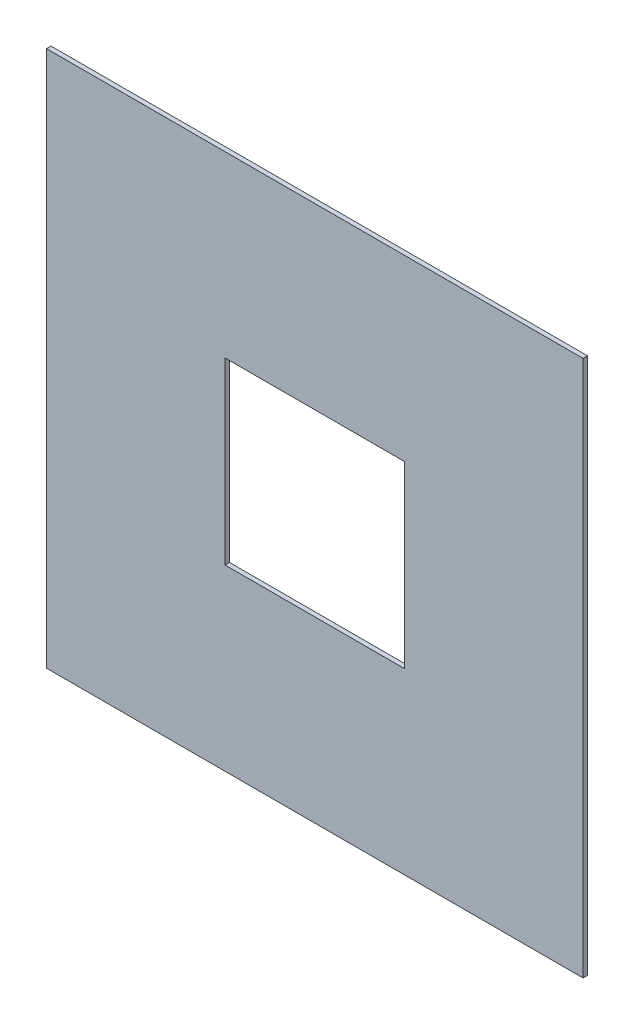
ISO-10303-21;
HEADER;
FILE_DESCRIPTION(('STEP AP214'),'2;1');
FILE_NAME('part.step','',(''),(''),'','','');
FILE_SCHEMA(('AUTOMOTIVE_DESIGN { 1 0 10303 214 1 1 1 1 }'));
ENDSEC;
DATA;
#1=APPLICATION_CONTEXT('core data for automotive mechanical design processes');
#2=APPLICATION_PROTOCOL_DEFINITION('international standard','automotive_design',2000,#1);
#3=PRODUCT_CONTEXT('',#1,'mechanical');
#4=PRODUCT('Part','Part','',(#3));
#5=PRODUCT_RELATED_PRODUCT_CATEGORY('part','',(#4));
#6=PRODUCT_DEFINITION_FORMATION('','',#4);
#7=PRODUCT_DEFINITION_CONTEXT('part definition',#1,'design');
#8=PRODUCT_DEFINITION('design','',#6,#7);
#9=PRODUCT_DEFINITION_SHAPE('','',#8);
#10=(LENGTH_UNIT() NAMED_UNIT(*) SI_UNIT(.MILLI.,.METRE.));
#11=(NAMED_UNIT(*) PLANE_ANGLE_UNIT() SI_UNIT($,.RADIAN.));
#12=(NAMED_UNIT(*) SI_UNIT($,.STERADIAN.) SOLID_ANGLE_UNIT());
#13=UNCERTAINTY_MEASURE_WITH_UNIT(LENGTH_MEASURE(1.E-05),#10,'distance_accuracy_value','');
#14=(GEOMETRIC_REPRESENTATION_CONTEXT(3) GLOBAL_UNCERTAINTY_ASSIGNED_CONTEXT((#13)) GLOBAL_UNIT_ASSIGNED_CONTEXT((#10,
#11,#12)) REPRESENTATION_CONTEXT('',''));
#15=CARTESIAN_POINT('',(0.,0.,0.));
#16=DIRECTION('',(0.,0.,1.));
#17=DIRECTION('',(1.,0.,0.));
#18=AXIS2_PLACEMENT_3D('',#15,#16,#17);
#19=CARTESIAN_POINT('',(0.,0.,1.));
#20=DIRECTION('',(0.,0.,1.));
#21=DIRECTION('',(1.,0.,0.));
#22=AXIS2_PLACEMENT_3D('',#19,#20,#21);
#23=PLANE('',#22);
#24=DIRECTION('',(0.,1.,0.));
#25=VECTOR('',#24,1.);
#26=CARTESIAN_POINT('',(60.,60.,1.));
#27=LINE('',#26,#25);
#28=CARTESIAN_POINT('',(60.,-60.,1.));
#29=VERTEX_POINT('',#28);
#30=CARTESIAN_POINT('',(60.,60.,1.));
#31=VERTEX_POINT('',#30);
#32=EDGE_CURVE('E153',#29,#31,#27,.T.);
#33=ORIENTED_EDGE('',*,*,#32,.T.);
#34=DIRECTION('',(-1.,0.,0.));
#35=VECTOR('',#34,1.);
#36=CARTESIAN_POINT('',(-60.,60.,1.));
#37=LINE('',#36,#35);
#38=CARTESIAN_POINT('',(-60.,60.,1.));
#39=VERTEX_POINT('',#38);
#40=EDGE_CURVE('E157',#31,#39,#37,.T.);
#41=ORIENTED_EDGE('',*,*,#40,.T.);
#42=DIRECTION('',(0.,-1.,0.));
#43=VECTOR('',#42,1.);
#44=CARTESIAN_POINT('',(-60.,60.,1.));
#45=LINE('',#44,#43);
#46=CARTESIAN_POINT('',(-60.,-60.,1.));
#47=VERTEX_POINT('',#46);
#48=EDGE_CURVE('E161',#39,#47,#45,.T.);
#49=ORIENTED_EDGE('',*,*,#48,.T.);
#50=DIRECTION('',(1.,0.,0.));
#51=VECTOR('',#50,1.);
#52=CARTESIAN_POINT('',(-60.,-60.,1.));
#53=LINE('',#52,#51);
#54=EDGE_CURVE('E164',#47,#29,#53,.T.);
#55=ORIENTED_EDGE('',*,*,#54,.T.);
#56=EDGE_LOOP('',(#33,#41,#49,#55));
#57=FACE_BOUND('',#56,.T.);
#58=DIRECTION('',(-1.,0.,0.));
#59=VECTOR('',#58,1.);
#60=CARTESIAN_POINT('',(-20.05,20.05,1.));
#61=LINE('',#60,#59);
#62=CARTESIAN_POINT('',(20.05,20.05,1.));
#63=VERTEX_POINT('',#62);
#64=CARTESIAN_POINT('',(-20.05,20.05,1.));
#65=VERTEX_POINT('',#64);
#66=EDGE_CURVE('E114',#63,#65,#61,.T.);
#67=ORIENTED_EDGE('',*,*,#66,.F.);
#68=DIRECTION('',(0.,1.,0.));
#69=VECTOR('',#68,1.);
#70=CARTESIAN_POINT('',(20.05,20.05,1.));
#71=LINE('',#70,#69);
#72=CARTESIAN_POINT('',(20.05,-20.05,1.));
#73=VERTEX_POINT('',#72);
#74=EDGE_CURVE('E105',#73,#63,#71,.T.);
#75=ORIENTED_EDGE('',*,*,#74,.F.);
#76=DIRECTION('',(1.,0.,0.));
#77=VECTOR('',#76,1.);
#78=CARTESIAN_POINT('',(-20.05,-20.05,1.));
#79=LINE('',#78,#77);
#80=CARTESIAN_POINT('',(-20.05,-20.05,1.));
#81=VERTEX_POINT('',#80);
#82=EDGE_CURVE('E131',#81,#73,#79,.T.);
#83=ORIENTED_EDGE('',*,*,#82,.F.);
#84=DIRECTION('',(0.,-1.,0.));
#85=VECTOR('',#84,1.);
#86=CARTESIAN_POINT('',(-20.05,20.05,1.));
#87=LINE('',#86,#85);
#88=EDGE_CURVE('E127',#65,#81,#87,.T.);
#89=ORIENTED_EDGE('',*,*,#88,.F.);
#90=EDGE_LOOP('',(#67,#75,#83,#89));
#91=FACE_BOUND('',#90,.T.);
#92=ADVANCED_FACE('F39',(#57,#91),#23,.T.);
#93=CARTESIAN_POINT('',(0.,0.,0.));
#94=DIRECTION('',(0.,0.,1.));
#95=DIRECTION('',(1.,0.,0.));
#96=AXIS2_PLACEMENT_3D('',#93,#94,#95);
#97=PLANE('',#96);
#98=DIRECTION('',(0.,1.,0.));
#99=VECTOR('',#98,1.);
#100=CARTESIAN_POINT('',(60.,60.,0.));
#101=LINE('',#100,#99);
#102=CARTESIAN_POINT('',(60.,-60.,0.));
#103=VERTEX_POINT('',#102);
#104=CARTESIAN_POINT('',(60.,60.,0.));
#105=VERTEX_POINT('',#104);
#106=EDGE_CURVE('E123',#103,#105,#101,.T.);
#107=ORIENTED_EDGE('',*,*,#106,.F.);
#108=DIRECTION('',(1.,0.,0.));
#109=VECTOR('',#108,1.);
#110=CARTESIAN_POINT('',(-60.,-60.,0.));
#111=LINE('',#110,#109);
#112=CARTESIAN_POINT('',(-60.,-60.,0.));
#113=VERTEX_POINT('',#112);
#114=EDGE_CURVE('E158',#113,#103,#111,.T.);
#115=ORIENTED_EDGE('',*,*,#114,.F.);
#116=DIRECTION('',(0.,-1.,0.));
#117=VECTOR('',#116,1.);
#118=CARTESIAN_POINT('',(-60.,60.,0.));
#119=LINE('',#118,#117);
#120=CARTESIAN_POINT('',(-60.,60.,0.));
#121=VERTEX_POINT('',#120);
#122=EDGE_CURVE('E174',#121,#113,#119,.T.);
#123=ORIENTED_EDGE('',*,*,#122,.F.);
#124=DIRECTION('',(-1.,0.,0.));
#125=VECTOR('',#124,1.);
#126=CARTESIAN_POINT('',(-60.,60.,0.));
#127=LINE('',#126,#125);
#128=EDGE_CURVE('E171',#105,#121,#127,.T.);
#129=ORIENTED_EDGE('',*,*,#128,.F.);
#130=EDGE_LOOP('',(#107,#115,#123,#129));
#131=FACE_BOUND('',#130,.T.);
#132=DIRECTION('',(0.,1.,0.));
#133=VECTOR('',#132,1.);
#134=CARTESIAN_POINT('',(20.05,20.05,0.));
#135=LINE('',#134,#133);
#136=CARTESIAN_POINT('',(20.05,-20.05,0.));
#137=VERTEX_POINT('',#136);
#138=CARTESIAN_POINT('',(20.05,20.05,0.));
#139=VERTEX_POINT('',#138);
#140=EDGE_CURVE('E63',#137,#139,#135,.T.);
#141=ORIENTED_EDGE('',*,*,#140,.T.);
#142=DIRECTION('',(-1.,0.,0.));
#143=VECTOR('',#142,1.);
#144=CARTESIAN_POINT('',(-20.05,20.05,0.));
#145=LINE('',#144,#143);
#146=CARTESIAN_POINT('',(-20.05,20.05,0.));
#147=VERTEX_POINT('',#146);
#148=EDGE_CURVE('E121',#139,#147,#145,.T.);
#149=ORIENTED_EDGE('',*,*,#148,.T.);
#150=DIRECTION('',(0.,-1.,0.));
#151=VECTOR('',#150,1.);
#152=CARTESIAN_POINT('',(-20.05,20.05,0.));
#153=LINE('',#152,#151);
#154=CARTESIAN_POINT('',(-20.05,-20.05,0.));
#155=VERTEX_POINT('',#154);
#156=EDGE_CURVE('E140',#147,#155,#153,.T.);
#157=ORIENTED_EDGE('',*,*,#156,.T.);
#158=DIRECTION('',(1.,0.,0.));
#159=VECTOR('',#158,1.);
#160=CARTESIAN_POINT('',(-20.05,-20.05,0.));
#161=LINE('',#160,#159);
#162=EDGE_CURVE('E115',#155,#137,#161,.T.);
#163=ORIENTED_EDGE('',*,*,#162,.T.);
#164=EDGE_LOOP('',(#141,#149,#157,#163));
#165=FACE_BOUND('',#164,.T.);
#166=ADVANCED_FACE('F197',(#131,#165),#97,.F.);
#167=CARTESIAN_POINT('',(60.,60.,1.));
#168=DIRECTION('',(-1.,0.,0.));
#169=DIRECTION('',(0.,-1.,0.));
#170=AXIS2_PLACEMENT_3D('',#167,#168,#169);
#171=PLANE('',#170);
#172=ORIENTED_EDGE('',*,*,#106,.T.);
#173=DIRECTION('',(0.,0.,-1.));
#174=VECTOR('',#173,1.);
#175=CARTESIAN_POINT('',(60.,60.,1.));
#176=LINE('',#175,#174);
#177=EDGE_CURVE('E11',#31,#105,#176,.T.);
#178=ORIENTED_EDGE('',*,*,#177,.F.);
#179=ORIENTED_EDGE('',*,*,#32,.F.);
#180=DIRECTION('',(0.,0.,-1.));
#181=VECTOR('',#180,1.);
#182=CARTESIAN_POINT('',(60.,-60.,1.));
#183=LINE('',#182,#181);
#184=EDGE_CURVE('E167',#29,#103,#183,.T.);
#185=ORIENTED_EDGE('',*,*,#184,.T.);
#186=EDGE_LOOP('',(#172,#178,#179,#185));
#187=FACE_BOUND('',#186,.T.);
#188=ADVANCED_FACE('F41',(#187),#171,.F.);
#189=CARTESIAN_POINT('',(-60.,60.,1.));
#190=DIRECTION('',(0.,-1.,0.));
#191=DIRECTION('',(0.,0.,-1.));
#192=AXIS2_PLACEMENT_3D('',#189,#190,#191);
#193=PLANE('',#192);
#194=ORIENTED_EDGE('',*,*,#128,.T.);
#195=DIRECTION('',(0.,0.,-1.));
#196=VECTOR('',#195,1.);
#197=CARTESIAN_POINT('',(-60.,60.,1.));
#198=LINE('',#197,#196);
#199=EDGE_CURVE('E48',#39,#121,#198,.T.);
#200=ORIENTED_EDGE('',*,*,#199,.F.);
#201=ORIENTED_EDGE('',*,*,#40,.F.);
#202=ORIENTED_EDGE('',*,*,#177,.T.);
#203=EDGE_LOOP('',(#194,#200,#201,#202));
#204=FACE_BOUND('',#203,.T.);
#205=ADVANCED_FACE('F207',(#204),#193,.F.);
#206=CARTESIAN_POINT('',(-60.,60.,1.));
#207=DIRECTION('',(1.,0.,0.));
#208=DIRECTION('',(0.,0.,-1.));
#209=AXIS2_PLACEMENT_3D('',#206,#207,#208);
#210=PLANE('',#209);
#211=ORIENTED_EDGE('',*,*,#122,.T.);
#212=DIRECTION('',(0.,0.,-1.));
#213=VECTOR('',#212,1.);
#214=CARTESIAN_POINT('',(-60.,-60.,1.));
#215=LINE('',#214,#213);
#216=EDGE_CURVE('E182',#47,#113,#215,.T.);
#217=ORIENTED_EDGE('',*,*,#216,.F.);
#218=ORIENTED_EDGE('',*,*,#48,.F.);
#219=ORIENTED_EDGE('',*,*,#199,.T.);
#220=EDGE_LOOP('',(#211,#217,#218,#219));
#221=FACE_BOUND('',#220,.T.);
#222=ADVANCED_FACE('F191',(#221),#210,.F.);
#223=CARTESIAN_POINT('',(-60.,-60.,1.));
#224=DIRECTION('',(0.,1.,0.));
#225=DIRECTION('',(0.,0.,1.));
#226=AXIS2_PLACEMENT_3D('',#223,#224,#225);
#227=PLANE('',#226);
#228=ORIENTED_EDGE('',*,*,#114,.T.);
#229=ORIENTED_EDGE('',*,*,#184,.F.);
#230=ORIENTED_EDGE('',*,*,#54,.F.);
#231=ORIENTED_EDGE('',*,*,#216,.T.);
#232=EDGE_LOOP('',(#228,#229,#230,#231));
#233=FACE_BOUND('',#232,.T.);
#234=ADVANCED_FACE('F201',(#233),#227,.F.);
#235=CARTESIAN_POINT('',(20.05,20.05,1.));
#236=DIRECTION('',(-1.,0.,0.));
#237=DIRECTION('',(0.,0.,1.));
#238=AXIS2_PLACEMENT_3D('',#235,#236,#237);
#239=PLANE('',#238);
#240=ORIENTED_EDGE('',*,*,#140,.F.);
#241=DIRECTION('',(0.,0.,-1.));
#242=VECTOR('',#241,1.);
#243=CARTESIAN_POINT('',(20.05,-20.05,1.));
#244=LINE('',#243,#242);
#245=EDGE_CURVE('E109',#73,#137,#244,.T.);
#246=ORIENTED_EDGE('',*,*,#245,.F.);
#247=ORIENTED_EDGE('',*,*,#74,.T.);
#248=DIRECTION('',(0.,0.,-1.));
#249=VECTOR('',#248,1.);
#250=CARTESIAN_POINT('',(20.05,20.05,1.));
#251=LINE('',#250,#249);
#252=EDGE_CURVE('E108',#63,#139,#251,.T.);
#253=ORIENTED_EDGE('',*,*,#252,.T.);
#254=EDGE_LOOP('',(#240,#246,#247,#253));
#255=FACE_BOUND('',#254,.T.);
#256=ADVANCED_FACE('F107',(#255),#239,.T.);
#257=CARTESIAN_POINT('',(-20.05,20.05,1.));
#258=DIRECTION('',(0.,-1.,0.));
#259=DIRECTION('',(0.,0.,-1.));
#260=AXIS2_PLACEMENT_3D('',#257,#258,#259);
#261=PLANE('',#260);
#262=ORIENTED_EDGE('',*,*,#148,.F.);
#263=ORIENTED_EDGE('',*,*,#252,.F.);
#264=ORIENTED_EDGE('',*,*,#66,.T.);
#265=DIRECTION('',(0.,0.,-1.));
#266=VECTOR('',#265,1.);
#267=CARTESIAN_POINT('',(-20.05,20.05,1.));
#268=LINE('',#267,#266);
#269=EDGE_CURVE('E124',#65,#147,#268,.T.);
#270=ORIENTED_EDGE('',*,*,#269,.T.);
#271=EDGE_LOOP('',(#262,#263,#264,#270));
#272=FACE_BOUND('',#271,.T.);
#273=ADVANCED_FACE('F118',(#272),#261,.T.);
#274=CARTESIAN_POINT('',(-20.05,20.05,1.));
#275=DIRECTION('',(1.,0.,0.));
#276=DIRECTION('',(0.,1.,0.));
#277=AXIS2_PLACEMENT_3D('',#274,#275,#276);
#278=PLANE('',#277);
#279=ORIENTED_EDGE('',*,*,#156,.F.);
#280=ORIENTED_EDGE('',*,*,#269,.F.);
#281=ORIENTED_EDGE('',*,*,#88,.T.);
#282=DIRECTION('',(0.,0.,-1.));
#283=VECTOR('',#282,1.);
#284=CARTESIAN_POINT('',(-20.05,-20.05,1.));
#285=LINE('',#284,#283);
#286=EDGE_CURVE('E55',#81,#155,#285,.T.);
#287=ORIENTED_EDGE('',*,*,#286,.T.);
#288=EDGE_LOOP('',(#279,#280,#281,#287));
#289=FACE_BOUND('',#288,.T.);
#290=ADVANCED_FACE('F230',(#289),#278,.T.);
#291=CARTESIAN_POINT('',(-20.05,-20.05,1.));
#292=DIRECTION('',(0.,1.,0.));
#293=DIRECTION('',(0.,0.,1.));
#294=AXIS2_PLACEMENT_3D('',#291,#292,#293);
#295=PLANE('',#294);
#296=ORIENTED_EDGE('',*,*,#162,.F.);
#297=ORIENTED_EDGE('',*,*,#286,.F.);
#298=ORIENTED_EDGE('',*,*,#82,.T.);
#299=ORIENTED_EDGE('',*,*,#245,.T.);
#300=EDGE_LOOP('',(#296,#297,#298,#299));
#301=FACE_BOUND('',#300,.T.);
#302=ADVANCED_FACE('F234',(#301),#295,.T.);
#303=CLOSED_SHELL('',(#92,#166,#188,#205,#222,#234,#256,#273,#290,#302));
#304=MANIFOLD_SOLID_BREP('B2',#303);
#305=ADVANCED_BREP_SHAPE_REPRESENTATION('',(#18,#304),#14);
#306=SHAPE_DEFINITION_REPRESENTATION(#9,#305);
ENDSEC;
END-ISO-10303-21;
